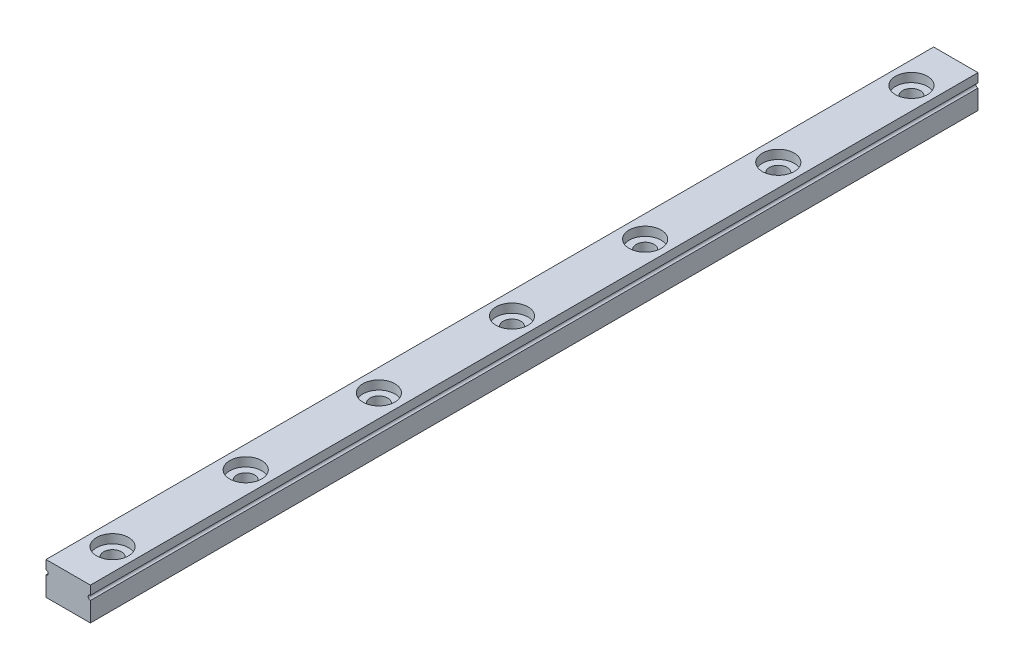
ISO-10303-21;
HEADER;
FILE_DESCRIPTION(('STEP AP214'),'2;1');
FILE_NAME('part.step','',(''),(''),'','','');
FILE_SCHEMA(('AUTOMOTIVE_DESIGN { 1 0 10303 214 1 1 1 1 }'));
ENDSEC;
DATA;
#1=APPLICATION_CONTEXT('core data for automotive mechanical design processes');
#2=APPLICATION_PROTOCOL_DEFINITION('international standard','automotive_design',2000,#1);
#3=PRODUCT_CONTEXT('',#1,'mechanical');
#4=PRODUCT('Part','Part','',(#3));
#5=PRODUCT_RELATED_PRODUCT_CATEGORY('part','',(#4));
#6=PRODUCT_DEFINITION_FORMATION('','',#4);
#7=PRODUCT_DEFINITION_CONTEXT('part definition',#1,'design');
#8=PRODUCT_DEFINITION('design','',#6,#7);
#9=PRODUCT_DEFINITION_SHAPE('','',#8);
#10=(LENGTH_UNIT() NAMED_UNIT(*) SI_UNIT(.MILLI.,.METRE.));
#11=(NAMED_UNIT(*) PLANE_ANGLE_UNIT() SI_UNIT($,.RADIAN.));
#12=(NAMED_UNIT(*) SI_UNIT($,.STERADIAN.) SOLID_ANGLE_UNIT());
#13=UNCERTAINTY_MEASURE_WITH_UNIT(LENGTH_MEASURE(1.E-05),#10,'distance_accuracy_value','');
#14=(GEOMETRIC_REPRESENTATION_CONTEXT(3) GLOBAL_UNCERTAINTY_ASSIGNED_CONTEXT((#13)) GLOBAL_UNIT_ASSIGNED_CONTEXT((#10,
#11,#12)) REPRESENTATION_CONTEXT('',''));
#15=CARTESIAN_POINT('',(0.,0.,0.));
#16=DIRECTION('',(0.,0.,1.));
#17=DIRECTION('',(1.,0.,0.));
#18=AXIS2_PLACEMENT_3D('',#15,#16,#17);
#19=CARTESIAN_POINT('',(-2.49999999999999,0.,50.));
#20=DIRECTION('',(1.,0.,0.));
#21=DIRECTION('',(0.,1.,0.));
#22=AXIS2_PLACEMENT_3D('',#19,#20,#21);
#23=PLANE('',#22);
#24=DIRECTION('',(0.,-1.,0.));
#25=VECTOR('',#24,1.);
#26=CARTESIAN_POINT('',(-2.49999999999999,0.,-50.));
#27=LINE('',#26,#25);
#28=CARTESIAN_POINT('',(-2.49999999999999,3.7,-50.));
#29=VERTEX_POINT('',#28);
#30=CARTESIAN_POINT('',(-2.49999999999999,2.7,-50.));
#31=VERTEX_POINT('',#30);
#32=EDGE_CURVE('E139',#29,#31,#27,.T.);
#33=ORIENTED_EDGE('',*,*,#32,.T.);
#34=DIRECTION('',(0.,0.,-1.));
#35=VECTOR('',#34,1.);
#36=CARTESIAN_POINT('',(-2.49999999999999,2.7,50.));
#37=LINE('',#36,#35);
#38=CARTESIAN_POINT('',(-2.49999999999999,2.7,50.));
#39=VERTEX_POINT('',#38);
#40=EDGE_CURVE('E11',#39,#31,#37,.T.);
#41=ORIENTED_EDGE('',*,*,#40,.F.);
#42=DIRECTION('',(0.,-1.,0.));
#43=VECTOR('',#42,1.);
#44=CARTESIAN_POINT('',(-2.49999999999999,0.,50.));
#45=LINE('',#44,#43);
#46=CARTESIAN_POINT('',(-2.49999999999999,3.7,50.));
#47=VERTEX_POINT('',#46);
#48=EDGE_CURVE('E159',#47,#39,#45,.T.);
#49=ORIENTED_EDGE('',*,*,#48,.F.);
#50=DIRECTION('',(0.,0.,-1.));
#51=VECTOR('',#50,1.);
#52=CARTESIAN_POINT('',(-2.49999999999999,3.7,50.));
#53=LINE('',#52,#51);
#54=EDGE_CURVE('E58',#47,#29,#53,.T.);
#55=ORIENTED_EDGE('',*,*,#54,.T.);
#56=EDGE_LOOP('',(#33,#41,#49,#55));
#57=FACE_BOUND('',#56,.T.);
#58=ADVANCED_FACE('F40',(#57),#23,.F.);
#59=CARTESIAN_POINT('',(-2.49999999999999,2.45,50.));
#60=DIRECTION('',(0.,0.,-1.));
#61=DIRECTION('',(-1.,0.,0.));
#62=AXIS2_PLACEMENT_3D('',#59,#60,#61);
#63=CYLINDRICAL_SURFACE('',#62,0.25);
#64=CARTESIAN_POINT('',(-2.49999999999999,2.45,-50.));
#65=DIRECTION('',(0.,0.,1.));
#66=DIRECTION('',(1.,0.,0.));
#67=AXIS2_PLACEMENT_3D('',#64,#65,#66);
#68=CIRCLE('',#67,0.25);
#69=CARTESIAN_POINT('',(-2.49999999999999,2.2,-50.));
#70=VERTEX_POINT('',#69);
#71=EDGE_CURVE('E141',#31,#70,#68,.F.);
#72=ORIENTED_EDGE('',*,*,#71,.T.);
#73=DIRECTION('',(0.,0.,-1.));
#74=VECTOR('',#73,1.);
#75=CARTESIAN_POINT('',(-2.49999999999999,2.2,50.));
#76=LINE('',#75,#74);
#77=CARTESIAN_POINT('',(-2.49999999999999,2.2,50.));
#78=VERTEX_POINT('',#77);
#79=EDGE_CURVE('E49',#78,#70,#76,.T.);
#80=ORIENTED_EDGE('',*,*,#79,.F.);
#81=CARTESIAN_POINT('',(-2.49999999999999,2.45,50.));
#82=DIRECTION('',(0.,0.,1.));
#83=DIRECTION('',(1.,0.,0.));
#84=AXIS2_PLACEMENT_3D('',#81,#82,#83);
#85=CIRCLE('',#84,0.25);
#86=EDGE_CURVE('E96',#39,#78,#85,.F.);
#87=ORIENTED_EDGE('',*,*,#86,.F.);
#88=ORIENTED_EDGE('',*,*,#40,.T.);
#89=EDGE_LOOP('',(#72,#80,#87,#88));
#90=FACE_BOUND('',#89,.T.);
#91=ADVANCED_FACE('F264',(#90),#63,.F.);
#92=CARTESIAN_POINT('',(-2.5,0.,50.));
#93=DIRECTION('',(1.,0.,0.));
#94=DIRECTION('',(0.,1.,0.));
#95=AXIS2_PLACEMENT_3D('',#92,#93,#94);
#96=PLANE('',#95);
#97=DIRECTION('',(0.,-1.,0.));
#98=VECTOR('',#97,1.);
#99=CARTESIAN_POINT('',(-2.5,0.,-50.));
#100=LINE('',#99,#98);
#101=CARTESIAN_POINT('',(-2.5,0.,-50.));
#102=VERTEX_POINT('',#101);
#103=EDGE_CURVE('E144',#70,#102,#100,.T.);
#104=ORIENTED_EDGE('',*,*,#103,.T.);
#105=DIRECTION('',(0.,0.,-1.));
#106=VECTOR('',#105,1.);
#107=CARTESIAN_POINT('',(-2.5,0.,50.));
#108=LINE('',#107,#106);
#109=CARTESIAN_POINT('',(-2.5,0.,50.));
#110=VERTEX_POINT('',#109);
#111=EDGE_CURVE('E165',#110,#102,#108,.T.);
#112=ORIENTED_EDGE('',*,*,#111,.F.);
#113=DIRECTION('',(0.,-1.,0.));
#114=VECTOR('',#113,1.);
#115=CARTESIAN_POINT('',(-2.5,0.,50.));
#116=LINE('',#115,#114);
#117=EDGE_CURVE('E240',#78,#110,#116,.T.);
#118=ORIENTED_EDGE('',*,*,#117,.F.);
#119=ORIENTED_EDGE('',*,*,#79,.T.);
#120=EDGE_LOOP('',(#104,#112,#118,#119));
#121=FACE_BOUND('',#120,.T.);
#122=ADVANCED_FACE('F268',(#121),#96,.F.);
#123=CARTESIAN_POINT('',(0.,0.,50.));
#124=DIRECTION('',(0.,-1.,0.));
#125=DIRECTION('',(1.,0.,0.));
#126=AXIS2_PLACEMENT_3D('',#123,#124,#125);
#127=PLANE('',#126);
#128=CARTESIAN_POINT('',(0.,0.,15.));
#129=DIRECTION('',(0.,1.,0.));
#130=DIRECTION('',(-1.,0.,0.));
#131=AXIS2_PLACEMENT_3D('',#128,#129,#130);
#132=CIRCLE('',#131,1.);
#133=CARTESIAN_POINT('',(-1.,0.,15.));
#134=VERTEX_POINT('',#133);
#135=EDGE_CURVE('E188',#134,#134,#132,.T.);
#136=ORIENTED_EDGE('',*,*,#135,.T.);
#137=EDGE_LOOP('',(#136));
#138=FACE_BOUND('',#137,.T.);
#139=CARTESIAN_POINT('',(0.,0.,30.));
#140=DIRECTION('',(0.,1.,0.));
#141=DIRECTION('',(-1.,0.,0.));
#142=AXIS2_PLACEMENT_3D('',#139,#140,#141);
#143=CIRCLE('',#142,1.);
#144=CARTESIAN_POINT('',(-1.,0.,30.));
#145=VERTEX_POINT('',#144);
#146=EDGE_CURVE('E622',#145,#145,#143,.T.);
#147=ORIENTED_EDGE('',*,*,#146,.T.);
#148=EDGE_LOOP('',(#147));
#149=FACE_BOUND('',#148,.T.);
#150=CARTESIAN_POINT('',(0.,0.,45.));
#151=DIRECTION('',(0.,1.,0.));
#152=DIRECTION('',(-1.,0.,0.));
#153=AXIS2_PLACEMENT_3D('',#150,#151,#152);
#154=CIRCLE('',#153,1.);
#155=CARTESIAN_POINT('',(-1.,0.,45.));
#156=VERTEX_POINT('',#155);
#157=EDGE_CURVE('E620',#156,#156,#154,.T.);
#158=ORIENTED_EDGE('',*,*,#157,.T.);
#159=EDGE_LOOP('',(#158));
#160=FACE_BOUND('',#159,.T.);
#161=CARTESIAN_POINT('',(0.,0.,-15.));
#162=DIRECTION('',(0.,1.,0.));
#163=DIRECTION('',(-1.,0.,0.));
#164=AXIS2_PLACEMENT_3D('',#161,#162,#163);
#165=CIRCLE('',#164,1.);
#166=CARTESIAN_POINT('',(-1.,0.,-15.));
#167=VERTEX_POINT('',#166);
#168=EDGE_CURVE('E178',#167,#167,#165,.T.);
#169=ORIENTED_EDGE('',*,*,#168,.T.);
#170=EDGE_LOOP('',(#169));
#171=FACE_BOUND('',#170,.T.);
#172=CARTESIAN_POINT('',(0.,0.,-30.));
#173=DIRECTION('',(0.,1.,0.));
#174=DIRECTION('',(-1.,0.,0.));
#175=AXIS2_PLACEMENT_3D('',#172,#173,#174);
#176=CIRCLE('',#175,1.);
#177=CARTESIAN_POINT('',(-1.,0.,-30.));
#178=VERTEX_POINT('',#177);
#179=EDGE_CURVE('E208',#178,#178,#176,.T.);
#180=ORIENTED_EDGE('',*,*,#179,.T.);
#181=EDGE_LOOP('',(#180));
#182=FACE_BOUND('',#181,.T.);
#183=CARTESIAN_POINT('',(0.,0.,-45.));
#184=DIRECTION('',(0.,1.,0.));
#185=DIRECTION('',(-1.,0.,0.));
#186=AXIS2_PLACEMENT_3D('',#183,#184,#185);
#187=CIRCLE('',#186,1.);
#188=CARTESIAN_POINT('',(-1.,0.,-45.));
#189=VERTEX_POINT('',#188);
#190=EDGE_CURVE('E211',#189,#189,#187,.T.);
#191=ORIENTED_EDGE('',*,*,#190,.T.);
#192=EDGE_LOOP('',(#191));
#193=FACE_BOUND('',#192,.T.);
#194=CARTESIAN_POINT('',(0.,0.,0.));
#195=DIRECTION('',(0.,1.,0.));
#196=DIRECTION('',(-1.,0.,0.));
#197=AXIS2_PLACEMENT_3D('',#194,#195,#196);
#198=CIRCLE('',#197,1.);
#199=CARTESIAN_POINT('',(-1.,0.,0.));
#200=VERTEX_POINT('',#199);
#201=EDGE_CURVE('E173',#200,#200,#198,.T.);
#202=ORIENTED_EDGE('',*,*,#201,.T.);
#203=EDGE_LOOP('',(#202));
#204=FACE_BOUND('',#203,.T.);
#205=DIRECTION('',(-1.,0.,0.));
#206=VECTOR('',#205,1.);
#207=CARTESIAN_POINT('',(0.,0.,-50.));
#208=LINE('',#207,#206);
#209=CARTESIAN_POINT('',(2.5,0.,-50.));
#210=VERTEX_POINT('',#209);
#211=EDGE_CURVE('E147',#210,#102,#208,.T.);
#212=ORIENTED_EDGE('',*,*,#211,.F.);
#213=DIRECTION('',(0.,0.,-1.));
#214=VECTOR('',#213,1.);
#215=CARTESIAN_POINT('',(2.5,0.,50.));
#216=LINE('',#215,#214);
#217=CARTESIAN_POINT('',(2.5,0.,50.));
#218=VERTEX_POINT('',#217);
#219=EDGE_CURVE('E163',#218,#210,#216,.T.);
#220=ORIENTED_EDGE('',*,*,#219,.F.);
#221=DIRECTION('',(-1.,0.,0.));
#222=VECTOR('',#221,1.);
#223=CARTESIAN_POINT('',(0.,0.,50.));
#224=LINE('',#223,#222);
#225=EDGE_CURVE('E242',#218,#110,#224,.T.);
#226=ORIENTED_EDGE('',*,*,#225,.T.);
#227=ORIENTED_EDGE('',*,*,#111,.T.);
#228=EDGE_LOOP('',(#212,#220,#226,#227));
#229=FACE_BOUND('',#228,.T.);
#230=ADVANCED_FACE('F275',(#138,#149,#160,#171,#182,#193,#204,#229),#127,.T.);
#231=CARTESIAN_POINT('',(2.5,0.,50.));
#232=DIRECTION('',(1.,0.,0.));
#233=DIRECTION('',(0.,1.,0.));
#234=AXIS2_PLACEMENT_3D('',#231,#232,#233);
#235=PLANE('',#234);
#236=DIRECTION('',(0.,-1.,0.));
#237=VECTOR('',#236,1.);
#238=CARTESIAN_POINT('',(2.5,0.,-50.));
#239=LINE('',#238,#237);
#240=CARTESIAN_POINT('',(2.5,2.2,-50.));
#241=VERTEX_POINT('',#240);
#242=EDGE_CURVE('E150',#241,#210,#239,.T.);
#243=ORIENTED_EDGE('',*,*,#242,.F.);
#244=DIRECTION('',(0.,0.,-1.));
#245=VECTOR('',#244,1.);
#246=CARTESIAN_POINT('',(2.5,2.2,50.));
#247=LINE('',#246,#245);
#248=CARTESIAN_POINT('',(2.5,2.2,50.));
#249=VERTEX_POINT('',#248);
#250=EDGE_CURVE('E121',#249,#241,#247,.T.);
#251=ORIENTED_EDGE('',*,*,#250,.F.);
#252=DIRECTION('',(0.,-1.,0.));
#253=VECTOR('',#252,1.);
#254=CARTESIAN_POINT('',(2.5,0.,50.));
#255=LINE('',#254,#253);
#256=EDGE_CURVE('E131',#249,#218,#255,.T.);
#257=ORIENTED_EDGE('',*,*,#256,.T.);
#258=ORIENTED_EDGE('',*,*,#219,.T.);
#259=EDGE_LOOP('',(#243,#251,#257,#258));
#260=FACE_BOUND('',#259,.T.);
#261=ADVANCED_FACE('F246',(#260),#235,.T.);
#262=CARTESIAN_POINT('',(2.49999999999999,2.45,50.));
#263=DIRECTION('',(0.,0.,-1.));
#264=DIRECTION('',(-1.,0.,0.));
#265=AXIS2_PLACEMENT_3D('',#262,#263,#264);
#266=CYLINDRICAL_SURFACE('',#265,0.25);
#267=CARTESIAN_POINT('',(2.49999999999999,2.45,-50.));
#268=DIRECTION('',(0.,0.,1.));
#269=DIRECTION('',(1.,0.,0.));
#270=AXIS2_PLACEMENT_3D('',#267,#268,#269);
#271=CIRCLE('',#270,0.25);
#272=CARTESIAN_POINT('',(2.5,2.7,-50.));
#273=VERTEX_POINT('',#272);
#274=EDGE_CURVE('E117',#273,#241,#271,.T.);
#275=ORIENTED_EDGE('',*,*,#274,.F.);
#276=DIRECTION('',(0.,0.,-1.));
#277=VECTOR('',#276,1.);
#278=CARTESIAN_POINT('',(2.5,2.7,50.));
#279=LINE('',#278,#277);
#280=CARTESIAN_POINT('',(2.5,2.7,50.));
#281=VERTEX_POINT('',#280);
#282=EDGE_CURVE('E112',#281,#273,#279,.T.);
#283=ORIENTED_EDGE('',*,*,#282,.F.);
#284=CARTESIAN_POINT('',(2.49999999999999,2.45,50.));
#285=DIRECTION('',(0.,0.,1.));
#286=DIRECTION('',(1.,0.,0.));
#287=AXIS2_PLACEMENT_3D('',#284,#285,#286);
#288=CIRCLE('',#287,0.25);
#289=EDGE_CURVE('E115',#281,#249,#288,.T.);
#290=ORIENTED_EDGE('',*,*,#289,.T.);
#291=ORIENTED_EDGE('',*,*,#250,.T.);
#292=EDGE_LOOP('',(#275,#283,#290,#291));
#293=FACE_BOUND('',#292,.T.);
#294=ADVANCED_FACE('F114',(#293),#266,.F.);
#295=CARTESIAN_POINT('',(2.5,0.,50.));
#296=DIRECTION('',(1.,0.,0.));
#297=DIRECTION('',(0.,1.,0.));
#298=AXIS2_PLACEMENT_3D('',#295,#296,#297);
#299=PLANE('',#298);
#300=DIRECTION('',(0.,-1.,0.));
#301=VECTOR('',#300,1.);
#302=CARTESIAN_POINT('',(2.5,0.,-50.));
#303=LINE('',#302,#301);
#304=CARTESIAN_POINT('',(2.5,3.7,-50.));
#305=VERTEX_POINT('',#304);
#306=EDGE_CURVE('E154',#305,#273,#303,.T.);
#307=ORIENTED_EDGE('',*,*,#306,.F.);
#308=DIRECTION('',(0.,0.,-1.));
#309=VECTOR('',#308,1.);
#310=CARTESIAN_POINT('',(2.5,3.7,50.));
#311=LINE('',#310,#309);
#312=CARTESIAN_POINT('',(2.5,3.7,50.));
#313=VERTEX_POINT('',#312);
#314=EDGE_CURVE('E84',#313,#305,#311,.T.);
#315=ORIENTED_EDGE('',*,*,#314,.F.);
#316=DIRECTION('',(0.,-1.,0.));
#317=VECTOR('',#316,1.);
#318=CARTESIAN_POINT('',(2.5,0.,50.));
#319=LINE('',#318,#317);
#320=EDGE_CURVE('E128',#313,#281,#319,.T.);
#321=ORIENTED_EDGE('',*,*,#320,.T.);
#322=ORIENTED_EDGE('',*,*,#282,.T.);
#323=EDGE_LOOP('',(#307,#315,#321,#322));
#324=FACE_BOUND('',#323,.T.);
#325=ADVANCED_FACE('F133',(#324),#299,.T.);
#326=CARTESIAN_POINT('',(0.,3.7,50.));
#327=DIRECTION('',(0.,1.,0.));
#328=DIRECTION('',(-1.,0.,0.));
#329=AXIS2_PLACEMENT_3D('',#326,#327,#328);
#330=PLANE('',#329);
#331=CARTESIAN_POINT('',(0.,3.7,15.));
#332=DIRECTION('',(0.,1.,0.));
#333=DIRECTION('',(-1.,0.,0.));
#334=AXIS2_PLACEMENT_3D('',#331,#332,#333);
#335=CIRCLE('',#334,1.8);
#336=CARTESIAN_POINT('',(-1.8,3.7,15.));
#337=VERTEX_POINT('',#336);
#338=EDGE_CURVE('E630',#337,#337,#335,.T.);
#339=ORIENTED_EDGE('',*,*,#338,.F.);
#340=EDGE_LOOP('',(#339));
#341=FACE_BOUND('',#340,.T.);
#342=CARTESIAN_POINT('',(0.,3.7,30.));
#343=DIRECTION('',(0.,1.,0.));
#344=DIRECTION('',(-1.,0.,0.));
#345=AXIS2_PLACEMENT_3D('',#342,#343,#344);
#346=CIRCLE('',#345,1.8);
#347=CARTESIAN_POINT('',(-1.8,3.7,30.));
#348=VERTEX_POINT('',#347);
#349=EDGE_CURVE('E202',#348,#348,#346,.T.);
#350=ORIENTED_EDGE('',*,*,#349,.F.);
#351=EDGE_LOOP('',(#350));
#352=FACE_BOUND('',#351,.T.);
#353=CARTESIAN_POINT('',(0.,3.7,45.));
#354=DIRECTION('',(0.,1.,0.));
#355=DIRECTION('',(-1.,0.,0.));
#356=AXIS2_PLACEMENT_3D('',#353,#354,#355);
#357=CIRCLE('',#356,1.8);
#358=CARTESIAN_POINT('',(-1.8,3.7,45.));
#359=VERTEX_POINT('',#358);
#360=EDGE_CURVE('E193',#359,#359,#357,.T.);
#361=ORIENTED_EDGE('',*,*,#360,.F.);
#362=EDGE_LOOP('',(#361));
#363=FACE_BOUND('',#362,.T.);
#364=CARTESIAN_POINT('',(0.,3.7,-15.));
#365=DIRECTION('',(0.,1.,0.));
#366=DIRECTION('',(-1.,0.,0.));
#367=AXIS2_PLACEMENT_3D('',#364,#365,#366);
#368=CIRCLE('',#367,1.8);
#369=CARTESIAN_POINT('',(-1.8,3.7,-15.));
#370=VERTEX_POINT('',#369);
#371=EDGE_CURVE('E218',#370,#370,#368,.T.);
#372=ORIENTED_EDGE('',*,*,#371,.F.);
#373=EDGE_LOOP('',(#372));
#374=FACE_BOUND('',#373,.T.);
#375=CARTESIAN_POINT('',(0.,3.7,-30.));
#376=DIRECTION('',(0.,1.,0.));
#377=DIRECTION('',(-1.,0.,0.));
#378=AXIS2_PLACEMENT_3D('',#375,#376,#377);
#379=CIRCLE('',#378,1.8);
#380=CARTESIAN_POINT('',(-1.8,3.7,-30.));
#381=VERTEX_POINT('',#380);
#382=EDGE_CURVE('E224',#381,#381,#379,.T.);
#383=ORIENTED_EDGE('',*,*,#382,.F.);
#384=EDGE_LOOP('',(#383));
#385=FACE_BOUND('',#384,.T.);
#386=CARTESIAN_POINT('',(0.,3.7,-45.));
#387=DIRECTION('',(0.,1.,0.));
#388=DIRECTION('',(-1.,0.,0.));
#389=AXIS2_PLACEMENT_3D('',#386,#387,#388);
#390=CIRCLE('',#389,1.8);
#391=CARTESIAN_POINT('',(-1.8,3.7,-45.));
#392=VERTEX_POINT('',#391);
#393=EDGE_CURVE('E184',#392,#392,#390,.T.);
#394=ORIENTED_EDGE('',*,*,#393,.F.);
#395=EDGE_LOOP('',(#394));
#396=FACE_BOUND('',#395,.T.);
#397=CARTESIAN_POINT('',(0.,3.7,0.));
#398=DIRECTION('',(0.,1.,0.));
#399=DIRECTION('',(-1.,0.,0.));
#400=AXIS2_PLACEMENT_3D('',#397,#398,#399);
#401=CIRCLE('',#400,1.8);
#402=CARTESIAN_POINT('',(-1.8,3.7,0.));
#403=VERTEX_POINT('',#402);
#404=EDGE_CURVE('E172',#403,#403,#401,.T.);
#405=ORIENTED_EDGE('',*,*,#404,.F.);
#406=EDGE_LOOP('',(#405));
#407=FACE_BOUND('',#406,.T.);
#408=DIRECTION('',(1.,0.,0.));
#409=VECTOR('',#408,1.);
#410=CARTESIAN_POINT('',(0.,3.7,-50.));
#411=LINE('',#410,#409);
#412=EDGE_CURVE('E156',#29,#305,#411,.T.);
#413=ORIENTED_EDGE('',*,*,#412,.F.);
#414=ORIENTED_EDGE('',*,*,#54,.F.);
#415=DIRECTION('',(1.,0.,0.));
#416=VECTOR('',#415,1.);
#417=CARTESIAN_POINT('',(0.,3.7,50.));
#418=LINE('',#417,#416);
#419=EDGE_CURVE('E134',#47,#313,#418,.T.);
#420=ORIENTED_EDGE('',*,*,#419,.T.);
#421=ORIENTED_EDGE('',*,*,#314,.T.);
#422=EDGE_LOOP('',(#413,#414,#420,#421));
#423=FACE_BOUND('',#422,.T.);
#424=ADVANCED_FACE('F250',(#341,#352,#363,#374,#385,#396,#407,#423),#330,.T.);
#425=CARTESIAN_POINT('',(0.,0.,50.));
#426=DIRECTION('',(0.,0.,1.));
#427=DIRECTION('',(1.,0.,0.));
#428=AXIS2_PLACEMENT_3D('',#425,#426,#427);
#429=PLANE('',#428);
#430=ORIENTED_EDGE('',*,*,#48,.T.);
#431=ORIENTED_EDGE('',*,*,#86,.T.);
#432=ORIENTED_EDGE('',*,*,#117,.T.);
#433=ORIENTED_EDGE('',*,*,#225,.F.);
#434=ORIENTED_EDGE('',*,*,#256,.F.);
#435=ORIENTED_EDGE('',*,*,#289,.F.);
#436=ORIENTED_EDGE('',*,*,#320,.F.);
#437=ORIENTED_EDGE('',*,*,#419,.F.);
#438=EDGE_LOOP('',(#430,#431,#432,#433,#434,#435,#436,#437));
#439=FACE_BOUND('',#438,.T.);
#440=ADVANCED_FACE('F126',(#439),#429,.T.);
#441=CARTESIAN_POINT('',(0.,0.,-50.));
#442=DIRECTION('',(0.,0.,1.));
#443=DIRECTION('',(1.,0.,0.));
#444=AXIS2_PLACEMENT_3D('',#441,#442,#443);
#445=PLANE('',#444);
#446=ORIENTED_EDGE('',*,*,#32,.F.);
#447=ORIENTED_EDGE('',*,*,#412,.T.);
#448=ORIENTED_EDGE('',*,*,#306,.T.);
#449=ORIENTED_EDGE('',*,*,#274,.T.);
#450=ORIENTED_EDGE('',*,*,#242,.T.);
#451=ORIENTED_EDGE('',*,*,#211,.T.);
#452=ORIENTED_EDGE('',*,*,#103,.F.);
#453=ORIENTED_EDGE('',*,*,#71,.F.);
#454=EDGE_LOOP('',(#446,#447,#448,#449,#450,#451,#452,#453));
#455=FACE_BOUND('',#454,.T.);
#456=ADVANCED_FACE('F249',(#455),#445,.F.);
#457=CARTESIAN_POINT('',(0.,2.7,0.));
#458=DIRECTION('',(0.,1.,0.));
#459=DIRECTION('',(-1.,0.,0.));
#460=AXIS2_PLACEMENT_3D('',#457,#458,#459);
#461=CYLINDRICAL_SURFACE('',#460,1.8);
#462=CARTESIAN_POINT('',(0.,2.7,0.));
#463=DIRECTION('',(0.,1.,0.));
#464=DIRECTION('',(-1.,0.,0.));
#465=AXIS2_PLACEMENT_3D('',#462,#463,#464);
#466=CIRCLE('',#465,1.8);
#467=CARTESIAN_POINT('',(-1.8,2.7,0.));
#468=VERTEX_POINT('',#467);
#469=EDGE_CURVE('E142',#468,#468,#466,.T.);
#470=ORIENTED_EDGE('',*,*,#469,.F.);
#471=EDGE_LOOP('',(#470));
#472=FACE_BOUND('',#471,.T.);
#473=ORIENTED_EDGE('',*,*,#404,.T.);
#474=EDGE_LOOP('',(#473));
#475=FACE_BOUND('',#474,.T.);
#476=ADVANCED_FACE('F315',(#472,#475),#461,.F.);
#477=CARTESIAN_POINT('',(0.,2.7,0.));
#478=DIRECTION('',(0.,1.,0.));
#479=DIRECTION('',(-1.,0.,0.));
#480=AXIS2_PLACEMENT_3D('',#477,#478,#479);
#481=PLANE('',#480);
#482=CARTESIAN_POINT('',(0.,2.7,0.));
#483=DIRECTION('',(0.,1.,0.));
#484=DIRECTION('',(-1.,0.,0.));
#485=AXIS2_PLACEMENT_3D('',#482,#483,#484);
#486=CIRCLE('',#485,1.);
#487=CARTESIAN_POINT('',(-1.,2.7,0.));
#488=VERTEX_POINT('',#487);
#489=EDGE_CURVE('E169',#488,#488,#486,.T.);
#490=ORIENTED_EDGE('',*,*,#489,.F.);
#491=EDGE_LOOP('',(#490));
#492=FACE_BOUND('',#491,.T.);
#493=ORIENTED_EDGE('',*,*,#469,.T.);
#494=EDGE_LOOP('',(#493));
#495=FACE_BOUND('',#494,.T.);
#496=ADVANCED_FACE('F324',(#492,#495),#481,.T.);
#497=CARTESIAN_POINT('',(0.,0.,0.));
#498=DIRECTION('',(0.,1.,0.));
#499=DIRECTION('',(-1.,0.,0.));
#500=AXIS2_PLACEMENT_3D('',#497,#498,#499);
#501=CYLINDRICAL_SURFACE('',#500,1.);
#502=ORIENTED_EDGE('',*,*,#489,.T.);
#503=EDGE_LOOP('',(#502));
#504=FACE_BOUND('',#503,.T.);
#505=ORIENTED_EDGE('',*,*,#201,.F.);
#506=EDGE_LOOP('',(#505));
#507=FACE_BOUND('',#506,.T.);
#508=ADVANCED_FACE('F336',(#504,#507),#501,.F.);
#509=CARTESIAN_POINT('',(0.,2.7,-45.));
#510=DIRECTION('',(0.,1.,0.));
#511=DIRECTION('',(-1.,0.,0.));
#512=AXIS2_PLACEMENT_3D('',#509,#510,#511);
#513=CYLINDRICAL_SURFACE('',#512,1.8);
#514=CARTESIAN_POINT('',(0.,2.7,-45.));
#515=DIRECTION('',(0.,1.,0.));
#516=DIRECTION('',(-1.,0.,0.));
#517=AXIS2_PLACEMENT_3D('',#514,#515,#516);
#518=CIRCLE('',#517,1.8);
#519=CARTESIAN_POINT('',(-1.8,2.7,-45.));
#520=VERTEX_POINT('',#519);
#521=EDGE_CURVE('E227',#520,#520,#518,.T.);
#522=ORIENTED_EDGE('',*,*,#521,.F.);
#523=EDGE_LOOP('',(#522));
#524=FACE_BOUND('',#523,.T.);
#525=ORIENTED_EDGE('',*,*,#393,.T.);
#526=EDGE_LOOP('',(#525));
#527=FACE_BOUND('',#526,.T.);
#528=ADVANCED_FACE('F349',(#524,#527),#513,.F.);
#529=CARTESIAN_POINT('',(0.,2.7,-45.));
#530=DIRECTION('',(0.,1.,0.));
#531=DIRECTION('',(-1.,0.,0.));
#532=AXIS2_PLACEMENT_3D('',#529,#530,#531);
#533=PLANE('',#532);
#534=CARTESIAN_POINT('',(0.,2.7,-45.));
#535=DIRECTION('',(0.,1.,0.));
#536=DIRECTION('',(-1.,0.,0.));
#537=AXIS2_PLACEMENT_3D('',#534,#535,#536);
#538=CIRCLE('',#537,1.);
#539=CARTESIAN_POINT('',(-1.,2.7,-45.));
#540=VERTEX_POINT('',#539);
#541=EDGE_CURVE('E181',#540,#540,#538,.T.);
#542=ORIENTED_EDGE('',*,*,#541,.F.);
#543=EDGE_LOOP('',(#542));
#544=FACE_BOUND('',#543,.T.);
#545=ORIENTED_EDGE('',*,*,#521,.T.);
#546=EDGE_LOOP('',(#545));
#547=FACE_BOUND('',#546,.T.);
#548=ADVANCED_FACE('F360',(#544,#547),#533,.T.);
#549=CARTESIAN_POINT('',(0.,2.7,-30.));
#550=DIRECTION('',(0.,1.,0.));
#551=DIRECTION('',(-1.,0.,0.));
#552=AXIS2_PLACEMENT_3D('',#549,#550,#551);
#553=CYLINDRICAL_SURFACE('',#552,1.8);
#554=CARTESIAN_POINT('',(0.,2.7,-30.));
#555=DIRECTION('',(0.,1.,0.));
#556=DIRECTION('',(-1.,0.,0.));
#557=AXIS2_PLACEMENT_3D('',#554,#555,#556);
#558=CIRCLE('',#557,1.8);
#559=CARTESIAN_POINT('',(-1.8,2.7,-30.));
#560=VERTEX_POINT('',#559);
#561=EDGE_CURVE('E221',#560,#560,#558,.T.);
#562=ORIENTED_EDGE('',*,*,#561,.F.);
#563=EDGE_LOOP('',(#562));
#564=FACE_BOUND('',#563,.T.);
#565=ORIENTED_EDGE('',*,*,#382,.T.);
#566=EDGE_LOOP('',(#565));
#567=FACE_BOUND('',#566,.T.);
#568=ADVANCED_FACE('F371',(#564,#567),#553,.F.);
#569=CARTESIAN_POINT('',(0.,2.7,-30.));
#570=DIRECTION('',(0.,1.,0.));
#571=DIRECTION('',(-1.,0.,0.));
#572=AXIS2_PLACEMENT_3D('',#569,#570,#571);
#573=PLANE('',#572);
#574=CARTESIAN_POINT('',(0.,2.7,-30.));
#575=DIRECTION('',(0.,1.,0.));
#576=DIRECTION('',(-1.,0.,0.));
#577=AXIS2_PLACEMENT_3D('',#574,#575,#576);
#578=CIRCLE('',#577,1.);
#579=CARTESIAN_POINT('',(-1.,2.7,-30.));
#580=VERTEX_POINT('',#579);
#581=EDGE_CURVE('E177',#580,#580,#578,.T.);
#582=ORIENTED_EDGE('',*,*,#581,.F.);
#583=EDGE_LOOP('',(#582));
#584=FACE_BOUND('',#583,.T.);
#585=ORIENTED_EDGE('',*,*,#561,.T.);
#586=EDGE_LOOP('',(#585));
#587=FACE_BOUND('',#586,.T.);
#588=ADVANCED_FACE('F382',(#584,#587),#573,.T.);
#589=CARTESIAN_POINT('',(0.,2.7,-15.));
#590=DIRECTION('',(0.,1.,0.));
#591=DIRECTION('',(-1.,0.,0.));
#592=AXIS2_PLACEMENT_3D('',#589,#590,#591);
#593=CYLINDRICAL_SURFACE('',#592,1.8);
#594=CARTESIAN_POINT('',(0.,2.7,-15.));
#595=DIRECTION('',(0.,1.,0.));
#596=DIRECTION('',(-1.,0.,0.));
#597=AXIS2_PLACEMENT_3D('',#594,#595,#596);
#598=CIRCLE('',#597,1.8);
#599=CARTESIAN_POINT('',(-1.8,2.7,-15.));
#600=VERTEX_POINT('',#599);
#601=EDGE_CURVE('E215',#600,#600,#598,.T.);
#602=ORIENTED_EDGE('',*,*,#601,.F.);
#603=EDGE_LOOP('',(#602));
#604=FACE_BOUND('',#603,.T.);
#605=ORIENTED_EDGE('',*,*,#371,.T.);
#606=EDGE_LOOP('',(#605));
#607=FACE_BOUND('',#606,.T.);
#608=ADVANCED_FACE('F393',(#604,#607),#593,.F.);
#609=CARTESIAN_POINT('',(0.,2.7,-15.));
#610=DIRECTION('',(0.,1.,0.));
#611=DIRECTION('',(-1.,0.,0.));
#612=AXIS2_PLACEMENT_3D('',#609,#610,#611);
#613=PLANE('',#612);
#614=CARTESIAN_POINT('',(0.,2.7,-15.));
#615=DIRECTION('',(0.,1.,0.));
#616=DIRECTION('',(-1.,0.,0.));
#617=AXIS2_PLACEMENT_3D('',#614,#615,#616);
#618=CIRCLE('',#617,1.);
#619=CARTESIAN_POINT('',(-1.,2.7,-15.));
#620=VERTEX_POINT('',#619);
#621=EDGE_CURVE('E174',#620,#620,#618,.T.);
#622=ORIENTED_EDGE('',*,*,#621,.F.);
#623=EDGE_LOOP('',(#622));
#624=FACE_BOUND('',#623,.T.);
#625=ORIENTED_EDGE('',*,*,#601,.T.);
#626=EDGE_LOOP('',(#625));
#627=FACE_BOUND('',#626,.T.);
#628=ADVANCED_FACE('F404',(#624,#627),#613,.T.);
#629=CARTESIAN_POINT('',(0.,0.,-15.));
#630=DIRECTION('',(0.,1.,0.));
#631=DIRECTION('',(-1.,0.,0.));
#632=AXIS2_PLACEMENT_3D('',#629,#630,#631);
#633=CYLINDRICAL_SURFACE('',#632,1.);
#634=ORIENTED_EDGE('',*,*,#621,.T.);
#635=EDGE_LOOP('',(#634));
#636=FACE_BOUND('',#635,.T.);
#637=ORIENTED_EDGE('',*,*,#168,.F.);
#638=EDGE_LOOP('',(#637));
#639=FACE_BOUND('',#638,.T.);
#640=ADVANCED_FACE('F415',(#636,#639),#633,.F.);
#641=CARTESIAN_POINT('',(0.,0.,-30.));
#642=DIRECTION('',(0.,1.,0.));
#643=DIRECTION('',(-1.,0.,0.));
#644=AXIS2_PLACEMENT_3D('',#641,#642,#643);
#645=CYLINDRICAL_SURFACE('',#644,1.);
#646=ORIENTED_EDGE('',*,*,#581,.T.);
#647=EDGE_LOOP('',(#646));
#648=FACE_BOUND('',#647,.T.);
#649=ORIENTED_EDGE('',*,*,#179,.F.);
#650=EDGE_LOOP('',(#649));
#651=FACE_BOUND('',#650,.T.);
#652=ADVANCED_FACE('F426',(#648,#651),#645,.F.);
#653=CARTESIAN_POINT('',(0.,0.,-45.));
#654=DIRECTION('',(0.,1.,0.));
#655=DIRECTION('',(-1.,0.,0.));
#656=AXIS2_PLACEMENT_3D('',#653,#654,#655);
#657=CYLINDRICAL_SURFACE('',#656,1.);
#658=ORIENTED_EDGE('',*,*,#541,.T.);
#659=EDGE_LOOP('',(#658));
#660=FACE_BOUND('',#659,.T.);
#661=ORIENTED_EDGE('',*,*,#190,.F.);
#662=EDGE_LOOP('',(#661));
#663=FACE_BOUND('',#662,.T.);
#664=ADVANCED_FACE('F437',(#660,#663),#657,.F.);
#665=CARTESIAN_POINT('',(0.,2.7,45.));
#666=DIRECTION('',(0.,1.,0.));
#667=DIRECTION('',(-1.,0.,0.));
#668=AXIS2_PLACEMENT_3D('',#665,#666,#667);
#669=CYLINDRICAL_SURFACE('',#668,1.8);
#670=CARTESIAN_POINT('',(0.,2.7,45.));
#671=DIRECTION('',(0.,1.,0.));
#672=DIRECTION('',(-1.,0.,0.));
#673=AXIS2_PLACEMENT_3D('',#670,#671,#672);
#674=CIRCLE('',#673,1.8);
#675=CARTESIAN_POINT('',(-1.8,2.7,45.));
#676=VERTEX_POINT('',#675);
#677=EDGE_CURVE('E197',#676,#676,#674,.T.);
#678=ORIENTED_EDGE('',*,*,#677,.F.);
#679=EDGE_LOOP('',(#678));
#680=FACE_BOUND('',#679,.T.);
#681=ORIENTED_EDGE('',*,*,#360,.T.);
#682=EDGE_LOOP('',(#681));
#683=FACE_BOUND('',#682,.T.);
#684=ADVANCED_FACE('F447',(#680,#683),#669,.F.);
#685=CARTESIAN_POINT('',(0.,2.7,45.));
#686=DIRECTION('',(0.,1.,0.));
#687=DIRECTION('',(-1.,0.,0.));
#688=AXIS2_PLACEMENT_3D('',#685,#686,#687);
#689=PLANE('',#688);
#690=CARTESIAN_POINT('',(0.,2.7,45.));
#691=DIRECTION('',(0.,1.,0.));
#692=DIRECTION('',(-1.,0.,0.));
#693=AXIS2_PLACEMENT_3D('',#690,#691,#692);
#694=CIRCLE('',#693,1.);
#695=CARTESIAN_POINT('',(-1.,2.7,45.));
#696=VERTEX_POINT('',#695);
#697=EDGE_CURVE('E43',#696,#696,#694,.T.);
#698=ORIENTED_EDGE('',*,*,#697,.F.);
#699=EDGE_LOOP('',(#698));
#700=FACE_BOUND('',#699,.T.);
#701=ORIENTED_EDGE('',*,*,#677,.T.);
#702=EDGE_LOOP('',(#701));
#703=FACE_BOUND('',#702,.T.);
#704=ADVANCED_FACE('F467',(#700,#703),#689,.T.);
#705=CARTESIAN_POINT('',(0.,2.7,30.));
#706=DIRECTION('',(0.,1.,0.));
#707=DIRECTION('',(-1.,0.,0.));
#708=AXIS2_PLACEMENT_3D('',#705,#706,#707);
#709=CYLINDRICAL_SURFACE('',#708,1.8);
#710=CARTESIAN_POINT('',(0.,2.7,30.));
#711=DIRECTION('',(0.,1.,0.));
#712=DIRECTION('',(-1.,0.,0.));
#713=AXIS2_PLACEMENT_3D('',#710,#711,#712);
#714=CIRCLE('',#713,1.8);
#715=CARTESIAN_POINT('',(-1.8,2.7,30.));
#716=VERTEX_POINT('',#715);
#717=EDGE_CURVE('E633',#716,#716,#714,.T.);
#718=ORIENTED_EDGE('',*,*,#717,.F.);
#719=EDGE_LOOP('',(#718));
#720=FACE_BOUND('',#719,.T.);
#721=ORIENTED_EDGE('',*,*,#349,.T.);
#722=EDGE_LOOP('',(#721));
#723=FACE_BOUND('',#722,.T.);
#724=ADVANCED_FACE('F478',(#720,#723),#709,.F.);
#725=CARTESIAN_POINT('',(0.,2.7,30.));
#726=DIRECTION('',(0.,1.,0.));
#727=DIRECTION('',(-1.,0.,0.));
#728=AXIS2_PLACEMENT_3D('',#725,#726,#727);
#729=PLANE('',#728);
#730=CARTESIAN_POINT('',(0.,2.7,30.));
#731=DIRECTION('',(0.,1.,0.));
#732=DIRECTION('',(-1.,0.,0.));
#733=AXIS2_PLACEMENT_3D('',#730,#731,#732);
#734=CIRCLE('',#733,1.);
#735=CARTESIAN_POINT('',(-1.,2.7,30.));
#736=VERTEX_POINT('',#735);
#737=EDGE_CURVE('E187',#736,#736,#734,.T.);
#738=ORIENTED_EDGE('',*,*,#737,.F.);
#739=EDGE_LOOP('',(#738));
#740=FACE_BOUND('',#739,.T.);
#741=ORIENTED_EDGE('',*,*,#717,.T.);
#742=EDGE_LOOP('',(#741));
#743=FACE_BOUND('',#742,.T.);
#744=ADVANCED_FACE('F489',(#740,#743),#729,.T.);
#745=CARTESIAN_POINT('',(0.,2.7,15.));
#746=DIRECTION('',(0.,1.,0.));
#747=DIRECTION('',(-1.,0.,0.));
#748=AXIS2_PLACEMENT_3D('',#745,#746,#747);
#749=CYLINDRICAL_SURFACE('',#748,1.8);
#750=CARTESIAN_POINT('',(0.,2.7,15.));
#751=DIRECTION('',(0.,1.,0.));
#752=DIRECTION('',(-1.,0.,0.));
#753=AXIS2_PLACEMENT_3D('',#750,#751,#752);
#754=CIRCLE('',#753,1.8);
#755=CARTESIAN_POINT('',(-1.8,2.7,15.));
#756=VERTEX_POINT('',#755);
#757=EDGE_CURVE('E214',#756,#756,#754,.T.);
#758=ORIENTED_EDGE('',*,*,#757,.F.);
#759=EDGE_LOOP('',(#758));
#760=FACE_BOUND('',#759,.T.);
#761=ORIENTED_EDGE('',*,*,#338,.T.);
#762=EDGE_LOOP('',(#761));
#763=FACE_BOUND('',#762,.T.);
#764=ADVANCED_FACE('F500',(#760,#763),#749,.F.);
#765=CARTESIAN_POINT('',(0.,2.7,15.));
#766=DIRECTION('',(0.,1.,0.));
#767=DIRECTION('',(-1.,0.,0.));
#768=AXIS2_PLACEMENT_3D('',#765,#766,#767);
#769=PLANE('',#768);
#770=CARTESIAN_POINT('',(0.,2.7,15.));
#771=DIRECTION('',(0.,1.,0.));
#772=DIRECTION('',(-1.,0.,0.));
#773=AXIS2_PLACEMENT_3D('',#770,#771,#772);
#774=CIRCLE('',#773,1.);
#775=CARTESIAN_POINT('',(-1.,2.7,15.));
#776=VERTEX_POINT('',#775);
#777=EDGE_CURVE('E185',#776,#776,#774,.T.);
#778=ORIENTED_EDGE('',*,*,#777,.F.);
#779=EDGE_LOOP('',(#778));
#780=FACE_BOUND('',#779,.T.);
#781=ORIENTED_EDGE('',*,*,#757,.T.);
#782=EDGE_LOOP('',(#781));
#783=FACE_BOUND('',#782,.T.);
#784=ADVANCED_FACE('F511',(#780,#783),#769,.T.);
#785=CARTESIAN_POINT('',(0.,0.,15.));
#786=DIRECTION('',(0.,1.,0.));
#787=DIRECTION('',(-1.,0.,0.));
#788=AXIS2_PLACEMENT_3D('',#785,#786,#787);
#789=CYLINDRICAL_SURFACE('',#788,1.);
#790=CARTESIAN_POINT('',(-1.,2.7,15.));
#791=CARTESIAN_POINT('',(-1.,2.671875,15.));
#792=CARTESIAN_POINT('',(-1.,2.64375,15.));
#793=CARTESIAN_POINT('',(-1.,2.5875,15.));
#794=CARTESIAN_POINT('',(-1.,2.559375,15.));
#795=CARTESIAN_POINT('',(-1.,2.503125,15.));
#796=CARTESIAN_POINT('',(-1.,2.475,15.));
#797=CARTESIAN_POINT('',(-1.,2.41875,15.));
#798=CARTESIAN_POINT('',(-1.,2.390625,15.));
#799=CARTESIAN_POINT('',(-1.,2.334375,15.));
#800=CARTESIAN_POINT('',(-1.,2.30625,15.));
#801=CARTESIAN_POINT('',(-1.,2.25,15.));
#802=CARTESIAN_POINT('',(-1.,2.221875,15.));
#803=CARTESIAN_POINT('',(-1.,2.165625,15.));
#804=CARTESIAN_POINT('',(-1.,2.1375,15.));
#805=CARTESIAN_POINT('',(-1.,2.08125,15.));
#806=CARTESIAN_POINT('',(-1.,2.053125,15.));
#807=CARTESIAN_POINT('',(-1.,1.996875,15.));
#808=CARTESIAN_POINT('',(-1.,1.96875,15.));
#809=CARTESIAN_POINT('',(-1.,1.9125,15.));
#810=CARTESIAN_POINT('',(-1.,1.884375,15.));
#811=CARTESIAN_POINT('',(-1.,1.828125,15.));
#812=CARTESIAN_POINT('',(-1.,1.8,15.));
#813=CARTESIAN_POINT('',(-1.,1.74375,15.));
#814=CARTESIAN_POINT('',(-1.,1.715625,15.));
#815=CARTESIAN_POINT('',(-1.,1.659375,15.));
#816=CARTESIAN_POINT('',(-1.,1.63125,15.));
#817=CARTESIAN_POINT('',(-1.,1.575,15.));
#818=CARTESIAN_POINT('',(-1.,1.546875,15.));
#819=CARTESIAN_POINT('',(-1.,1.490625,15.));
#820=CARTESIAN_POINT('',(-1.,1.4625,15.));
#821=CARTESIAN_POINT('',(-1.,1.40625,15.));
#822=CARTESIAN_POINT('',(-1.,1.378125,15.));
#823=CARTESIAN_POINT('',(-1.,1.321875,15.));
#824=CARTESIAN_POINT('',(-1.,1.29375,15.));
#825=CARTESIAN_POINT('',(-1.,1.2375,15.));
#826=CARTESIAN_POINT('',(-1.,1.209375,15.));
#827=CARTESIAN_POINT('',(-1.,1.153125,15.));
#828=CARTESIAN_POINT('',(-1.,1.125,15.));
#829=CARTESIAN_POINT('',(-1.,1.06875,15.));
#830=CARTESIAN_POINT('',(-1.,1.040625,15.));
#831=CARTESIAN_POINT('',(-1.,0.984375,15.));
#832=CARTESIAN_POINT('',(-1.,0.95625,15.));
#833=CARTESIAN_POINT('',(-1.,0.9,15.));
#834=CARTESIAN_POINT('',(-1.,0.871875,15.));
#835=CARTESIAN_POINT('',(-1.,0.815625,15.));
#836=CARTESIAN_POINT('',(-1.,0.7875,15.));
#837=CARTESIAN_POINT('',(-1.,0.73125,15.));
#838=CARTESIAN_POINT('',(-1.,0.703125,15.));
#839=CARTESIAN_POINT('',(-1.,0.646875,15.));
#840=CARTESIAN_POINT('',(-1.,0.618749999999999,15.));
#841=CARTESIAN_POINT('',(-1.,0.562499999999999,15.));
#842=CARTESIAN_POINT('',(-1.,0.534374999999999,15.));
#843=CARTESIAN_POINT('',(-1.,0.478125,15.));
#844=CARTESIAN_POINT('',(-1.,0.45,15.));
#845=CARTESIAN_POINT('',(-1.,0.39375,15.));
#846=CARTESIAN_POINT('',(-1.,0.365625,15.));
#847=CARTESIAN_POINT('',(-1.,0.309374999999999,15.));
#848=CARTESIAN_POINT('',(-1.,0.281249999999999,15.));
#849=CARTESIAN_POINT('',(-1.,0.224999999999999,15.));
#850=CARTESIAN_POINT('',(-1.,0.196874999999999,15.));
#851=CARTESIAN_POINT('',(-1.,0.140625,15.));
#852=CARTESIAN_POINT('',(-1.,0.1125,15.));
#853=CARTESIAN_POINT('',(-1.,0.0562499999999996,15.));
#854=CARTESIAN_POINT('',(-1.,0.0281249999999995,15.));
#855=CARTESIAN_POINT('',(-1.,0.,15.));
#856=B_SPLINE_CURVE_WITH_KNOTS('',3,(#790,#791,#792,#793,#794,#795,#796,#797,#798,#799,#800,
#801,#802,#803,#804,#805,#806,#807,#808,#809,#810,#811,#812,#813,#814,#815,#816,#817,#818,#819,
#820,#821,#822,#823,#824,#825,#826,#827,#828,#829,#830,#831,#832,#833,#834,#835,#836,#837,#838,
#839,#840,#841,#842,#843,#844,#845,#846,#847,#848,#849,#850,#851,#852,#853,#854,#855),
.UNSPECIFIED.,.F.,.F.,(4,2,2,2,2,2,2,2,2,2,2,2,2,2,2,2,2,2,2,2,2,2,2,2,2,2,2,2,2,2,2,2,4),(0.,
0.0843750000000003,0.16875,0.253125,0.3375,0.421875,0.50625,0.590625,0.675,0.759375,0.84375,
0.928125,1.0125,1.096875,1.18125,1.265625,1.35,1.434375,1.51875,1.603125,1.6875,1.771875,
1.85625,1.940625,2.025,2.109375,2.19375,2.278125,2.3625,2.446875,2.53125,2.615625,2.7),.UNSPECIFIED.);
#857=EDGE_CURVE('BSEAM522',#776,#134,#856,.T.);
#858=ORIENTED_EDGE('',*,*,#777,.T.);
#859=ORIENTED_EDGE('',*,*,#135,.F.);
#860=ORIENTED_EDGE('',*,*,#857,.T.);
#861=ORIENTED_EDGE('',*,*,#857,.F.);
#862=EDGE_LOOP('',(#858,#860,#859,#861));
#863=FACE_BOUND('',#862,.T.);
#864=ADVANCED_FACE('F522',(#863),#789,.F.);
#865=CARTESIAN_POINT('',(0.,0.,30.));
#866=DIRECTION('',(0.,1.,0.));
#867=DIRECTION('',(-1.,0.,0.));
#868=AXIS2_PLACEMENT_3D('',#865,#866,#867);
#869=CYLINDRICAL_SURFACE('',#868,1.);
#870=CARTESIAN_POINT('',(-1.,2.7,30.));
#871=CARTESIAN_POINT('',(-1.,2.671875,30.));
#872=CARTESIAN_POINT('',(-1.,2.64375,30.));
#873=CARTESIAN_POINT('',(-1.,2.5875,30.));
#874=CARTESIAN_POINT('',(-1.,2.559375,30.));
#875=CARTESIAN_POINT('',(-1.,2.503125,30.));
#876=CARTESIAN_POINT('',(-1.,2.475,30.));
#877=CARTESIAN_POINT('',(-1.,2.41875,30.));
#878=CARTESIAN_POINT('',(-1.,2.390625,30.));
#879=CARTESIAN_POINT('',(-1.,2.334375,30.));
#880=CARTESIAN_POINT('',(-1.,2.30625,30.));
#881=CARTESIAN_POINT('',(-1.,2.25,30.));
#882=CARTESIAN_POINT('',(-1.,2.221875,30.));
#883=CARTESIAN_POINT('',(-1.,2.165625,30.));
#884=CARTESIAN_POINT('',(-1.,2.1375,30.));
#885=CARTESIAN_POINT('',(-1.,2.08125,30.));
#886=CARTESIAN_POINT('',(-1.,2.053125,30.));
#887=CARTESIAN_POINT('',(-1.,1.996875,30.));
#888=CARTESIAN_POINT('',(-1.,1.96875,30.));
#889=CARTESIAN_POINT('',(-1.,1.9125,30.));
#890=CARTESIAN_POINT('',(-1.,1.884375,30.));
#891=CARTESIAN_POINT('',(-1.,1.828125,30.));
#892=CARTESIAN_POINT('',(-1.,1.8,30.));
#893=CARTESIAN_POINT('',(-1.,1.74375,30.));
#894=CARTESIAN_POINT('',(-1.,1.715625,30.));
#895=CARTESIAN_POINT('',(-1.,1.659375,30.));
#896=CARTESIAN_POINT('',(-1.,1.63125,30.));
#897=CARTESIAN_POINT('',(-1.,1.575,30.));
#898=CARTESIAN_POINT('',(-1.,1.546875,30.));
#899=CARTESIAN_POINT('',(-1.,1.490625,30.));
#900=CARTESIAN_POINT('',(-1.,1.4625,30.));
#901=CARTESIAN_POINT('',(-1.,1.40625,30.));
#902=CARTESIAN_POINT('',(-1.,1.378125,30.));
#903=CARTESIAN_POINT('',(-1.,1.321875,30.));
#904=CARTESIAN_POINT('',(-1.,1.29375,30.));
#905=CARTESIAN_POINT('',(-1.,1.2375,30.));
#906=CARTESIAN_POINT('',(-1.,1.209375,30.));
#907=CARTESIAN_POINT('',(-1.,1.153125,30.));
#908=CARTESIAN_POINT('',(-1.,1.125,30.));
#909=CARTESIAN_POINT('',(-1.,1.06875,30.));
#910=CARTESIAN_POINT('',(-1.,1.040625,30.));
#911=CARTESIAN_POINT('',(-1.,0.984375,30.));
#912=CARTESIAN_POINT('',(-1.,0.95625,30.));
#913=CARTESIAN_POINT('',(-1.,0.9,30.));
#914=CARTESIAN_POINT('',(-1.,0.871875,30.));
#915=CARTESIAN_POINT('',(-1.,0.815625,30.));
#916=CARTESIAN_POINT('',(-1.,0.7875,30.));
#917=CARTESIAN_POINT('',(-1.,0.73125,30.));
#918=CARTESIAN_POINT('',(-1.,0.703125,30.));
#919=CARTESIAN_POINT('',(-1.,0.646875,30.));
#920=CARTESIAN_POINT('',(-1.,0.618749999999999,30.));
#921=CARTESIAN_POINT('',(-1.,0.562499999999999,30.));
#922=CARTESIAN_POINT('',(-1.,0.534374999999999,30.));
#923=CARTESIAN_POINT('',(-1.,0.478125,30.));
#924=CARTESIAN_POINT('',(-1.,0.45,30.));
#925=CARTESIAN_POINT('',(-1.,0.39375,30.));
#926=CARTESIAN_POINT('',(-1.,0.365625,30.));
#927=CARTESIAN_POINT('',(-1.,0.309374999999999,30.));
#928=CARTESIAN_POINT('',(-1.,0.281249999999999,30.));
#929=CARTESIAN_POINT('',(-1.,0.224999999999999,30.));
#930=CARTESIAN_POINT('',(-1.,0.196874999999999,30.));
#931=CARTESIAN_POINT('',(-1.,0.140625,30.));
#932=CARTESIAN_POINT('',(-1.,0.1125,30.));
#933=CARTESIAN_POINT('',(-1.,0.0562499999999996,30.));
#934=CARTESIAN_POINT('',(-1.,0.0281249999999995,30.));
#935=CARTESIAN_POINT('',(-1.,0.,30.));
#936=B_SPLINE_CURVE_WITH_KNOTS('',3,(#870,#871,#872,#873,#874,#875,#876,#877,#878,#879,#880,
#881,#882,#883,#884,#885,#886,#887,#888,#889,#890,#891,#892,#893,#894,#895,#896,#897,#898,#899,
#900,#901,#902,#903,#904,#905,#906,#907,#908,#909,#910,#911,#912,#913,#914,#915,#916,#917,#918,
#919,#920,#921,#922,#923,#924,#925,#926,#927,#928,#929,#930,#931,#932,#933,#934,#935),
.UNSPECIFIED.,.F.,.F.,(4,2,2,2,2,2,2,2,2,2,2,2,2,2,2,2,2,2,2,2,2,2,2,2,2,2,2,2,2,2,2,2,4),(0.,
0.0843750000000003,0.16875,0.253125,0.3375,0.421875,0.50625,0.590625,0.675,0.759375,0.84375,
0.928125,1.0125,1.096875,1.18125,1.265625,1.35,1.434375,1.51875,1.603125,1.6875,1.771875,
1.85625,1.940625,2.025,2.109375,2.19375,2.278125,2.3625,2.446875,2.53125,2.615625,2.7),.UNSPECIFIED.);
#937=EDGE_CURVE('BSEAM533',#736,#145,#936,.T.);
#938=ORIENTED_EDGE('',*,*,#737,.T.);
#939=ORIENTED_EDGE('',*,*,#146,.F.);
#940=ORIENTED_EDGE('',*,*,#937,.T.);
#941=ORIENTED_EDGE('',*,*,#937,.F.);
#942=EDGE_LOOP('',(#938,#940,#939,#941));
#943=FACE_BOUND('',#942,.T.);
#944=ADVANCED_FACE('F533',(#943),#869,.F.);
#945=CARTESIAN_POINT('',(0.,0.,45.));
#946=DIRECTION('',(0.,1.,0.));
#947=DIRECTION('',(-1.,0.,0.));
#948=AXIS2_PLACEMENT_3D('',#945,#946,#947);
#949=CYLINDRICAL_SURFACE('',#948,1.);
#950=CARTESIAN_POINT('',(-1.,2.7,45.));
#951=CARTESIAN_POINT('',(-1.,2.671875,45.));
#952=CARTESIAN_POINT('',(-1.,2.64375,45.));
#953=CARTESIAN_POINT('',(-1.,2.5875,45.));
#954=CARTESIAN_POINT('',(-1.,2.559375,45.));
#955=CARTESIAN_POINT('',(-1.,2.503125,45.));
#956=CARTESIAN_POINT('',(-1.,2.475,45.));
#957=CARTESIAN_POINT('',(-1.,2.41875,45.));
#958=CARTESIAN_POINT('',(-1.,2.390625,45.));
#959=CARTESIAN_POINT('',(-1.,2.334375,45.));
#960=CARTESIAN_POINT('',(-1.,2.30625,45.));
#961=CARTESIAN_POINT('',(-1.,2.25,45.));
#962=CARTESIAN_POINT('',(-1.,2.221875,45.));
#963=CARTESIAN_POINT('',(-1.,2.165625,45.));
#964=CARTESIAN_POINT('',(-1.,2.1375,45.));
#965=CARTESIAN_POINT('',(-1.,2.08125,45.));
#966=CARTESIAN_POINT('',(-1.,2.053125,45.));
#967=CARTESIAN_POINT('',(-1.,1.996875,45.));
#968=CARTESIAN_POINT('',(-1.,1.96875,45.));
#969=CARTESIAN_POINT('',(-1.,1.9125,45.));
#970=CARTESIAN_POINT('',(-1.,1.884375,45.));
#971=CARTESIAN_POINT('',(-1.,1.828125,45.));
#972=CARTESIAN_POINT('',(-1.,1.8,45.));
#973=CARTESIAN_POINT('',(-1.,1.74375,45.));
#974=CARTESIAN_POINT('',(-1.,1.715625,45.));
#975=CARTESIAN_POINT('',(-1.,1.659375,45.));
#976=CARTESIAN_POINT('',(-1.,1.63125,45.));
#977=CARTESIAN_POINT('',(-1.,1.575,45.));
#978=CARTESIAN_POINT('',(-1.,1.546875,45.));
#979=CARTESIAN_POINT('',(-1.,1.490625,45.));
#980=CARTESIAN_POINT('',(-1.,1.4625,45.));
#981=CARTESIAN_POINT('',(-1.,1.40625,45.));
#982=CARTESIAN_POINT('',(-1.,1.378125,45.));
#983=CARTESIAN_POINT('',(-1.,1.321875,45.));
#984=CARTESIAN_POINT('',(-1.,1.29375,45.));
#985=CARTESIAN_POINT('',(-1.,1.2375,45.));
#986=CARTESIAN_POINT('',(-1.,1.209375,45.));
#987=CARTESIAN_POINT('',(-1.,1.153125,45.));
#988=CARTESIAN_POINT('',(-1.,1.125,45.));
#989=CARTESIAN_POINT('',(-1.,1.06875,45.));
#990=CARTESIAN_POINT('',(-1.,1.040625,45.));
#991=CARTESIAN_POINT('',(-1.,0.984375,45.));
#992=CARTESIAN_POINT('',(-1.,0.95625,45.));
#993=CARTESIAN_POINT('',(-1.,0.9,45.));
#994=CARTESIAN_POINT('',(-1.,0.871875,45.));
#995=CARTESIAN_POINT('',(-1.,0.815625,45.));
#996=CARTESIAN_POINT('',(-1.,0.7875,45.));
#997=CARTESIAN_POINT('',(-1.,0.73125,45.));
#998=CARTESIAN_POINT('',(-1.,0.703125,45.));
#999=CARTESIAN_POINT('',(-1.,0.646875,45.));
#1000=CARTESIAN_POINT('',(-1.,0.618749999999999,45.));
#1001=CARTESIAN_POINT('',(-1.,0.562499999999999,45.));
#1002=CARTESIAN_POINT('',(-1.,0.534374999999999,45.));
#1003=CARTESIAN_POINT('',(-1.,0.478125,45.));
#1004=CARTESIAN_POINT('',(-1.,0.45,45.));
#1005=CARTESIAN_POINT('',(-1.,0.39375,45.));
#1006=CARTESIAN_POINT('',(-1.,0.365625,45.));
#1007=CARTESIAN_POINT('',(-1.,0.309374999999999,45.));
#1008=CARTESIAN_POINT('',(-1.,0.281249999999999,45.));
#1009=CARTESIAN_POINT('',(-1.,0.224999999999999,45.));
#1010=CARTESIAN_POINT('',(-1.,0.196874999999999,45.));
#1011=CARTESIAN_POINT('',(-1.,0.140625,45.));
#1012=CARTESIAN_POINT('',(-1.,0.1125,45.));
#1013=CARTESIAN_POINT('',(-1.,0.0562499999999996,45.));
#1014=CARTESIAN_POINT('',(-1.,0.0281249999999995,45.));
#1015=CARTESIAN_POINT('',(-1.,0.,45.));
#1016=B_SPLINE_CURVE_WITH_KNOTS('',3,(#950,#951,#952,#953,#954,#955,#956,#957,#958,#959,#960,
#961,#962,#963,#964,#965,#966,#967,#968,#969,#970,#971,#972,#973,#974,#975,#976,#977,#978,#979,
#980,#981,#982,#983,#984,#985,#986,#987,#988,#989,#990,#991,#992,#993,#994,#995,#996,#997,#998,
#999,#1000,#1001,#1002,#1003,#1004,#1005,#1006,#1007,#1008,#1009,#1010,#1011,#1012,#1013,#1014,
#1015),.UNSPECIFIED.,.F.,.F.,(4,2,2,2,2,2,2,2,2,2,2,2,2,2,2,2,2,2,2,2,2,2,2,2,2,2,2,2,2,2,2,2,
4),(0.,0.0843750000000003,0.16875,0.253125,0.3375,0.421875,0.50625,0.590625,0.675,0.759375,
0.84375,0.928125,1.0125,1.096875,1.18125,1.265625,1.35,1.434375,1.51875,1.603125,1.6875,
1.771875,1.85625,1.940625,2.025,2.109375,2.19375,2.278125,2.3625,2.446875,2.53125,2.615625,2.7),.UNSPECIFIED.);
#1017=EDGE_CURVE('BSEAM544',#696,#156,#1016,.T.);
#1018=ORIENTED_EDGE('',*,*,#697,.T.);
#1019=ORIENTED_EDGE('',*,*,#157,.F.);
#1020=ORIENTED_EDGE('',*,*,#1017,.T.);
#1021=ORIENTED_EDGE('',*,*,#1017,.F.);
#1022=EDGE_LOOP('',(#1018,#1020,#1019,#1021));
#1023=FACE_BOUND('',#1022,.T.);
#1024=ADVANCED_FACE('F544',(#1023),#949,.F.);
#1025=CLOSED_SHELL('',(#58,#91,#122,#230,#261,#294,#325,#424,#440,#456,#476,#496,#508,#528,#548,
#568,#588,#608,#628,#640,#652,#664,#684,#704,#724,#744,#764,#784,#864,#944,#1024));
#1026=MANIFOLD_SOLID_BREP('B2',#1025);
#1027=ADVANCED_BREP_SHAPE_REPRESENTATION('',(#18,#1026),#14);
#1028=SHAPE_DEFINITION_REPRESENTATION(#9,#1027);
ENDSEC;
END-ISO-10303-21;
